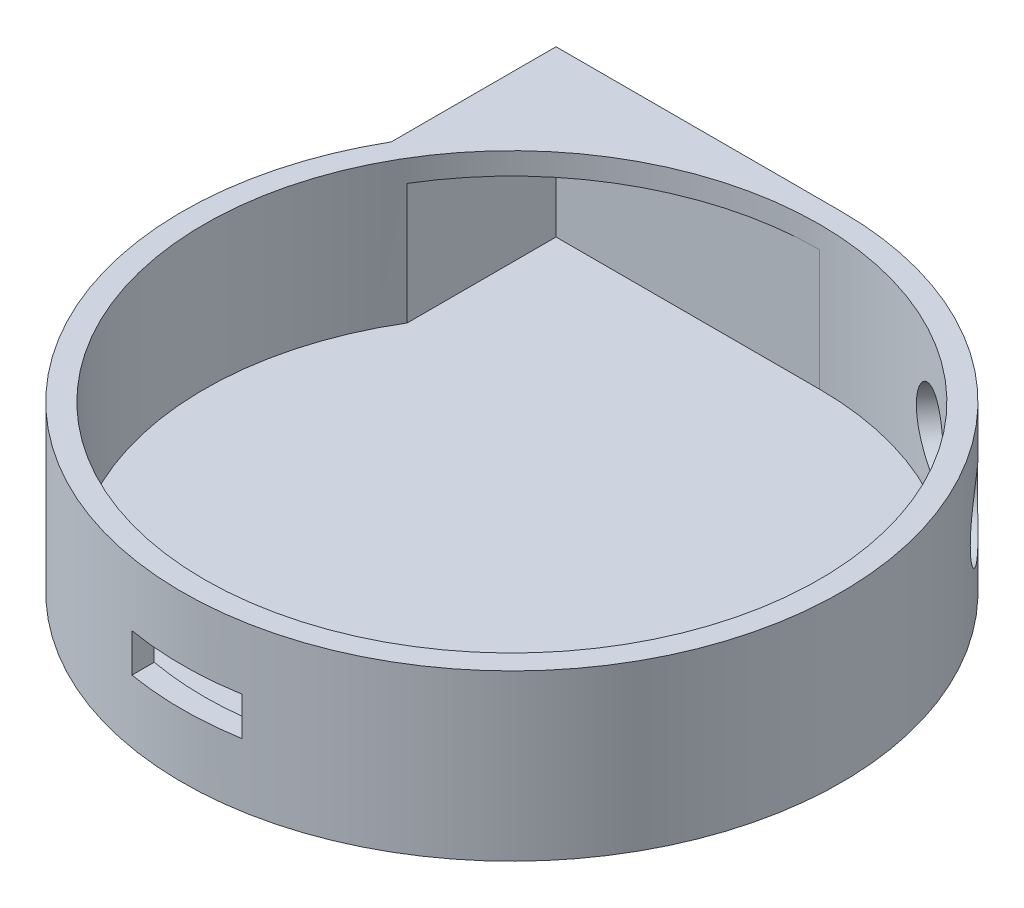
ISO-10303-21;
HEADER;
FILE_DESCRIPTION(('STEP AP214'),'2;1');
FILE_NAME('part.step','',(''),(''),'','','');
FILE_SCHEMA(('AUTOMOTIVE_DESIGN { 1 0 10303 214 1 1 1 1 }'));
ENDSEC;
DATA;
#1=APPLICATION_CONTEXT('core data for automotive mechanical design processes');
#2=APPLICATION_PROTOCOL_DEFINITION('international standard','automotive_design',2000,#1);
#3=PRODUCT_CONTEXT('',#1,'mechanical');
#4=PRODUCT('Part','Part','',(#3));
#5=PRODUCT_RELATED_PRODUCT_CATEGORY('part','',(#4));
#6=PRODUCT_DEFINITION_FORMATION('','',#4);
#7=PRODUCT_DEFINITION_CONTEXT('part definition',#1,'design');
#8=PRODUCT_DEFINITION('design','',#6,#7);
#9=PRODUCT_DEFINITION_SHAPE('','',#8);
#10=(LENGTH_UNIT() NAMED_UNIT(*) SI_UNIT(.MILLI.,.METRE.));
#11=(NAMED_UNIT(*) PLANE_ANGLE_UNIT() SI_UNIT($,.RADIAN.));
#12=(NAMED_UNIT(*) SI_UNIT($,.STERADIAN.) SOLID_ANGLE_UNIT());
#13=UNCERTAINTY_MEASURE_WITH_UNIT(LENGTH_MEASURE(1.E-05),#10,'distance_accuracy_value','');
#14=(GEOMETRIC_REPRESENTATION_CONTEXT(3) GLOBAL_UNCERTAINTY_ASSIGNED_CONTEXT((#13)) GLOBAL_UNIT_ASSIGNED_CONTEXT((#10,
#11,#12)) REPRESENTATION_CONTEXT('',''));
#15=CARTESIAN_POINT('',(0.,0.,0.));
#16=DIRECTION('',(0.,0.,1.));
#17=DIRECTION('',(1.,0.,0.));
#18=AXIS2_PLACEMENT_3D('',#15,#16,#17);
#19=CARTESIAN_POINT('',(0.,15.,-28.));
#20=DIRECTION('',(0.,0.,1.));
#21=DIRECTION('',(1.,0.,0.));
#22=AXIS2_PLACEMENT_3D('',#19,#20,#21);
#23=PLANE('',#22);
#24=DIRECTION('',(0.,-1.,0.));
#25=VECTOR('',#24,1.);
#26=CARTESIAN_POINT('',(0.,15.,-28.));
#27=LINE('',#26,#25);
#28=CARTESIAN_POINT('',(0.,13.,-28.));
#29=VERTEX_POINT('',#28);
#30=CARTESIAN_POINT('',(0.,2.,-28.));
#31=VERTEX_POINT('',#30);
#32=EDGE_CURVE('E70',#29,#31,#27,.T.);
#33=ORIENTED_EDGE('',*,*,#32,.F.);
#34=DIRECTION('',(-1.,0.,0.));
#35=VECTOR('',#34,1.);
#36=CARTESIAN_POINT('',(-23.9807621135331,13.,-28.));
#37=LINE('',#36,#35);
#38=CARTESIAN_POINT('',(-23.9807621135331,13.,-28.));
#39=VERTEX_POINT('',#38);
#40=EDGE_CURVE('E212',#29,#39,#37,.T.);
#41=ORIENTED_EDGE('',*,*,#40,.T.);
#42=DIRECTION('',(0.,-1.,0.));
#43=VECTOR('',#42,1.);
#44=CARTESIAN_POINT('',(-23.9807621135331,15.,-28.));
#45=LINE('',#44,#43);
#46=CARTESIAN_POINT('',(-23.9807621135331,2.,-28.));
#47=VERTEX_POINT('',#46);
#48=EDGE_CURVE('E244',#39,#47,#45,.T.);
#49=ORIENTED_EDGE('',*,*,#48,.T.);
#50=DIRECTION('',(-1.,0.,0.));
#51=VECTOR('',#50,1.);
#52=CARTESIAN_POINT('',(0.,2.,-28.));
#53=LINE('',#52,#51);
#54=EDGE_CURVE('E235',#31,#47,#53,.T.);
#55=ORIENTED_EDGE('',*,*,#54,.F.);
#56=EDGE_LOOP('',(#33,#41,#49,#55));
#57=FACE_BOUND('',#56,.T.);
#58=ADVANCED_FACE('F38',(#57),#23,.T.);
#59=CARTESIAN_POINT('',(-23.9807621135331,15.,-28.));
#60=DIRECTION('',(1.,0.,0.));
#61=DIRECTION('',(0.,0.,-1.));
#62=AXIS2_PLACEMENT_3D('',#59,#60,#61);
#63=PLANE('',#62);
#64=ORIENTED_EDGE('',*,*,#48,.F.);
#65=DIRECTION('',(0.,0.,1.));
#66=VECTOR('',#65,1.);
#67=CARTESIAN_POINT('',(-23.9807621135331,13.,-14.4541706249142));
#68=LINE('',#67,#66);
#69=CARTESIAN_POINT('',(-23.9807621135331,13.,-14.4541706249142));
#70=VERTEX_POINT('',#69);
#71=EDGE_CURVE('E218',#39,#70,#68,.T.);
#72=ORIENTED_EDGE('',*,*,#71,.T.);
#73=DIRECTION('',(0.,-1.,0.));
#74=VECTOR('',#73,1.);
#75=CARTESIAN_POINT('',(-23.9807621135331,15.,-14.4541706249142));
#76=LINE('',#75,#74);
#77=CARTESIAN_POINT('',(-23.9807621135331,2.,-14.4541706249142));
#78=VERTEX_POINT('',#77);
#79=EDGE_CURVE('E230',#70,#78,#76,.T.);
#80=ORIENTED_EDGE('',*,*,#79,.T.);
#81=DIRECTION('',(0.,0.,1.));
#82=VECTOR('',#81,1.);
#83=CARTESIAN_POINT('',(-23.9807621135331,2.,-28.));
#84=LINE('',#83,#82);
#85=EDGE_CURVE('E231',#47,#78,#84,.T.);
#86=ORIENTED_EDGE('',*,*,#85,.F.);
#87=EDGE_LOOP('',(#64,#72,#80,#86));
#88=FACE_BOUND('',#87,.T.);
#89=ADVANCED_FACE('F311',(#88),#63,.T.);
#90=CARTESIAN_POINT('',(0.,2.,0.));
#91=DIRECTION('',(0.,-1.,0.));
#92=DIRECTION('',(0.,0.,-1.));
#93=AXIS2_PLACEMENT_3D('',#90,#91,#92);
#94=CYLINDRICAL_SURFACE('',#93,30.);
#95=CARTESIAN_POINT('',(20.0389566293642,7.5,-22.3257747280237));
#96=CARTESIAN_POINT('',(20.0389637945299,7.3035632484837,-22.3257705114627));
#97=CARTESIAN_POINT('',(20.0513196641735,7.10700178050645,-22.3146971251879));
#98=CARTESIAN_POINT('',(20.100329738802,6.71930794639895,-22.2705588473128));
#99=CARTESIAN_POINT('',(20.1370096863303,6.52818155601912,-22.2374706569862));
#100=CARTESIAN_POINT('',(20.2333131524531,6.1569955120017,-22.1498815270531));
#101=CARTESIAN_POINT('',(20.2929279064318,5.97693166122355,-22.0953887671104));
#102=CARTESIAN_POINT('',(20.432907357123,5.63297485888916,-21.9660041082097));
#103=CARTESIAN_POINT('',(20.5132673964238,5.46907828910427,-21.8911167877171));
#104=CARTESIAN_POINT('',(20.6917689369591,5.16218786421855,-21.7224703250559));
#105=CARTESIAN_POINT('',(20.7898968126396,5.01917814247885,-21.6287256378958));
#106=CARTESIAN_POINT('',(21.000491043588,4.75796407194832,-21.4243054153114));
#107=CARTESIAN_POINT('',(21.112957544234,4.63975997469147,-21.313629708223));
#108=CARTESIAN_POINT('',(21.3481496827962,4.43161661861114,-21.0780484048878));
#109=CARTESIAN_POINT('',(21.4708595612192,4.34163491843072,-20.9531645642869));
#110=CARTESIAN_POINT('',(21.7225939858402,4.19210005858461,-20.6920701053367));
#111=CARTESIAN_POINT('',(21.8516185229927,4.13254685533245,-20.5558595032126));
#112=CARTESIAN_POINT('',(22.1122930857986,4.04518698834769,-20.2751884415133));
#113=CARTESIAN_POINT('',(22.2439498033879,4.01747569638072,-20.1307045517789));
#114=CARTESIAN_POINT('',(22.5056182436383,3.99460402244713,-19.83773499251));
#115=CARTESIAN_POINT('',(22.6356298596469,3.99944574018034,-19.6892490654555));
#116=CARTESIAN_POINT('',(22.892068646829,4.04152435748208,-19.3905241519328));
#117=CARTESIAN_POINT('',(23.0184310394554,4.07916382698086,-19.2402863555886));
#118=CARTESIAN_POINT('',(23.2626756147384,4.18612387011675,-18.9442545853886));
#119=CARTESIAN_POINT('',(23.3805568282268,4.25544805782133,-18.7984611204925));
#120=CARTESIAN_POINT('',(23.6069624693989,4.42519803050809,-18.5133739942603));
#121=CARTESIAN_POINT('',(23.7153031550304,4.52611214865009,-18.3742249359536));
#122=CARTESIAN_POINT('',(23.918042140513,4.75593964149584,-18.1095305720568));
#123=CARTESIAN_POINT('',(24.0124395995807,4.88485470351322,-17.9839860869506));
#124=CARTESIAN_POINT('',(24.1855216903356,5.16771967020593,-17.750542424074));
#125=CARTESIAN_POINT('',(24.2641611582852,5.32173930187923,-17.6426941206796));
#126=CARTESIAN_POINT('',(24.4036693396332,5.65041806627058,-17.4492176916881));
#127=CARTESIAN_POINT('',(24.4645403709028,5.82507450276286,-17.3635866680359));
#128=CARTESIAN_POINT('',(24.5659879977796,6.18605147202019,-17.219751660154));
#129=CARTESIAN_POINT('',(24.6069828374306,6.37202951093927,-17.1609840771776));
#130=CARTESIAN_POINT('',(24.6696781556365,6.75360408361224,-17.0707363219806));
#131=CARTESIAN_POINT('',(24.6913830202954,6.94919842015797,-17.0392499466715));
#132=CARTESIAN_POINT('',(24.7145938242672,7.3377277030516,-17.0055654091759));
#133=CARTESIAN_POINT('',(24.7167238212904,7.5305475043218,-17.0024623852858));
#134=CARTESIAN_POINT('',(24.7023653208344,7.91400472234951,-17.0233164962066));
#135=CARTESIAN_POINT('',(24.6858783554164,8.10464231738507,-17.0472714043167));
#136=CARTESIAN_POINT('',(24.634970657889,8.47611367113592,-17.1207524424735));
#137=CARTESIAN_POINT('',(24.600756797862,8.65703450307181,-17.1699835415977));
#138=CARTESIAN_POINT('',(24.5152680003269,9.00654037428347,-17.2918229703511));
#139=CARTESIAN_POINT('',(24.4639915147833,9.17512429257832,-17.3644334210922));
#140=CARTESIAN_POINT('',(24.3442442370064,9.49888423010685,-17.531929217319));
#141=CARTESIAN_POINT('',(24.2754507614667,9.65372557845812,-17.6272301310351));
#142=CARTESIAN_POINT('',(24.1225914066096,9.94229663946289,-17.8358424135173));
#143=CARTESIAN_POINT('',(24.0385229264709,10.0760227496406,-17.949156848971));
#144=CARTESIAN_POINT('',(23.8538477406065,10.3230226059943,-18.1939040629209));
#145=CARTESIAN_POINT('',(23.7527991753754,10.4355082581581,-18.3257993498028));
#146=CARTESIAN_POINT('',(23.5383063725614,10.6316709203741,-18.6004966471364));
#147=CARTESIAN_POINT('',(23.4248607849265,10.7153447886582,-18.7432998449632));
#148=CARTESIAN_POINT('',(23.1861191314815,10.8527339919558,-19.037866887467));
#149=CARTESIAN_POINT('',(23.0606571551671,10.9059271194473,-19.1897403645477));
#150=CARTESIAN_POINT('',(22.8026838101664,10.978470498804,-19.4955792735338));
#151=CARTESIAN_POINT('',(22.6701726670616,10.997821832975,-19.6495446383792));
#152=CARTESIAN_POINT('',(22.4027320452607,11.0018157842413,-19.9539055002358));
#153=CARTESIAN_POINT('',(22.2678263429517,10.9867032673697,-20.104318558149));
#154=CARTESIAN_POINT('',(21.9987674848002,10.9223922217258,-20.3983809925001));
#155=CARTESIAN_POINT('',(21.8646142589601,10.8731969182791,-20.5420310075654));
#156=CARTESIAN_POINT('',(21.6036418227631,10.7430114836614,-20.8162900651782));
#157=CARTESIAN_POINT('',(21.4767375599016,10.662565910736,-20.9470767960193));
#158=CARTESIAN_POINT('',(21.2321546739004,10.4720270919889,-21.1949512066881));
#159=CARTESIAN_POINT('',(21.1144752168041,10.3619365301836,-21.3120401253209));
#160=CARTESIAN_POINT('',(20.8935954472806,10.1164857640728,-21.5286181392546));
#161=CARTESIAN_POINT('',(20.7902590748825,9.98139616836151,-21.6282753467547));
#162=CARTESIAN_POINT('',(20.6002718097719,9.68899701453022,-21.809311523532));
#163=CARTESIAN_POINT('',(20.5136243937378,9.53168283834545,-21.890686684841));
#164=CARTESIAN_POINT('',(20.3602201131574,9.19948264516118,-22.0334392048592));
#165=CARTESIAN_POINT('',(20.293447575289,9.02461062060201,-22.0948323249901));
#166=CARTESIAN_POINT('',(20.1821791861417,8.66225888927409,-22.1965171482199));
#167=CARTESIAN_POINT('',(20.1376600692387,8.47479258331226,-22.2368308915371));
#168=CARTESIAN_POINT('',(20.0831320462646,8.15531800487354,-22.2860636185646));
#169=CARTESIAN_POINT('',(20.0665945536392,8.02527241275366,-22.30094183369));
#170=CARTESIAN_POINT('',(20.0445044316665,7.76350325830348,-22.3207988119031));
#171=CARTESIAN_POINT('',(20.0389518226092,7.63177969287427,-22.3257775567057));
#172=CARTESIAN_POINT('',(20.0389566293642,7.5,-22.3257747280237));
#173=B_SPLINE_CURVE_WITH_KNOTS('',3,(#95,#96,#97,#98,#99,#100,#101,#102,#103,#104,#105,#106,
#107,#108,#109,#110,#111,#112,#113,#114,#115,#116,#117,#118,#119,#120,#121,#122,#123,#124,#125,
#126,#127,#128,#129,#130,#131,#132,#133,#134,#135,#136,#137,#138,#139,#140,#141,#142,#143,#144,
#145,#146,#147,#148,#149,#150,#151,#152,#153,#154,#155,#156,#157,#158,#159,#160,#161,#162,#163,
#164,#165,#166,#167,#168,#169,#170,#171,#172),.UNSPECIFIED.,.T.,.F.,(4,2,2,2,2,2,2,2,2,2,2,2,2,
2,2,2,2,2,2,2,2,2,2,2,2,2,2,2,2,2,2,2,2,2,2,2,2,2,4),(0.,0.58883183811517,1.17828784261022,
1.76751880784998,2.35661760290563,2.94526653668943,3.53392143920217,4.12168681960561,
4.70945135807832,5.29897179655288,5.88853026001688,6.48542873356221,7.08239530838978,
7.68908821330915,8.29581768718676,8.90426198034726,9.51262686717679,10.1075653064958,
10.7023684356378,11.2781404614046,11.8538651081363,12.4230175484,12.9922216400652,
13.5727837979454,14.1534448988975,14.7526207257785,15.3518618688449,15.961084067399,
16.5702867818583,17.1751746015103,17.7800051871784,18.3747375522199,18.9694160891056,
19.5579985581133,20.1467035095596,20.7349429709456,21.3225661435701,21.7175835466598,
22.1126016793791),.UNSPECIFIED.);
#174=CARTESIAN_POINT('',(20.0389566293642,7.5,-22.3257747280237));
#175=VERTEX_POINT('',#174);
#176=EDGE_CURVE('E141',#175,#175,#173,.T.);
#177=ORIENTED_EDGE('',*,*,#176,.T.);
#178=EDGE_LOOP('',(#177));
#179=FACE_BOUND('',#178,.T.);
#180=CARTESIAN_POINT('',(12.4569898038769,7.5,-27.2914529665628));
#181=CARTESIAN_POINT('',(12.4569993073483,7.30801914953252,-27.2914504049319));
#182=CARTESIAN_POINT('',(12.4719666942975,7.1159133075882,-27.2846322120003));
#183=CARTESIAN_POINT('',(12.5312544884025,6.73713856654294,-27.2574518185044));
#184=CARTESIAN_POINT('',(12.575606745876,6.55047579665205,-27.2370749215309));
#185=CARTESIAN_POINT('',(12.6917843439682,6.188224147237,-27.1831322408752));
#186=CARTESIAN_POINT('',(12.7635709156434,6.0126200461419,-27.1495850670214));
#187=CARTESIAN_POINT('',(12.9318755181621,5.67688612062378,-27.069821353359));
#188=CARTESIAN_POINT('',(13.0283910020979,5.51675470495831,-27.0236061182391));
#189=CARTESIAN_POINT('',(13.2448889102017,5.21297444942567,-26.9181658813485));
#190=CARTESIAN_POINT('',(13.3652917575692,5.06970735378007,-26.858705036707));
#191=CARTESIAN_POINT('',(13.6243399871578,4.80687822699691,-26.728231601713));
#192=CARTESIAN_POINT('',(13.7629886195353,4.6873204287762,-26.6572169527256));
#193=CARTESIAN_POINT('',(14.0586114057681,4.47169745922206,-26.5025290298126));
#194=CARTESIAN_POINT('',(14.2160067487907,4.3764331230389,-26.4185430867947));
#195=CARTESIAN_POINT('',(14.540826447763,4.21672401627227,-26.2411620444131));
#196=CARTESIAN_POINT('',(14.708251502627,4.1522813962985,-26.1477662890225));
#197=CARTESIAN_POINT('',(15.0496688167354,4.0557077191913,-25.9527728696322));
#198=CARTESIAN_POINT('',(15.2237056310824,4.02386350068113,-25.8511107509395));
#199=CARTESIAN_POINT('',(15.5717832734015,3.99466888172788,-25.6429458297613));
#200=CARTESIAN_POINT('',(15.7458241002155,3.99731603719101,-25.5364433708003));
#201=CARTESIAN_POINT('',(16.0866982693606,4.03709727707668,-25.3230741789882));
#202=CARTESIAN_POINT('',(16.2535939038639,4.07380711697615,-25.2162280096596));
#203=CARTESIAN_POINT('',(16.5776917050701,4.18033301005883,-25.0043522863531));
#204=CARTESIAN_POINT('',(16.734894732873,4.25014611751483,-24.899322571598));
#205=CARTESIAN_POINT('',(17.0328948453807,4.41967016572208,-24.6964070199655));
#206=CARTESIAN_POINT('',(17.1739123261968,4.5188900951486,-24.5984343869306));
#207=CARTESIAN_POINT('',(17.4387446531315,4.74486463635083,-24.4114011244537));
#208=CARTESIAN_POINT('',(17.5625601734903,4.87161816843239,-24.3223401457529));
#209=CARTESIAN_POINT('',(17.789169033906,5.14809437904165,-24.1570909800734));
#210=CARTESIAN_POINT('',(17.8921016862765,5.29765233844681,-24.0808181181061));
#211=CARTESIAN_POINT('',(18.0756543468481,5.61613457048388,-23.9433479442164));
#212=CARTESIAN_POINT('',(18.1562743551538,5.78505884302487,-23.8821506322232));
#213=CARTESIAN_POINT('',(18.2934664291001,6.13755229570724,-23.7772282641851));
#214=CARTESIAN_POINT('',(18.3500289736656,6.32112723998365,-23.7335101261755));
#215=CARTESIAN_POINT('',(18.4378715653712,6.6976627930153,-23.6653334671287));
#216=CARTESIAN_POINT('',(18.4691514228852,6.89062347215425,-23.6408750905442));
#217=CARTESIAN_POINT('',(18.5058146220259,7.28076528546517,-23.6121870960918));
#218=CARTESIAN_POINT('',(18.5111587953512,7.47795235160864,-23.6079880741375));
#219=CARTESIAN_POINT('',(18.4957356493125,7.8706714445441,-23.6200731142969));
#220=CARTESIAN_POINT('',(18.4749681967319,8.06620346288724,-23.6363572809117));
#221=CARTESIAN_POINT('',(18.4077322652502,8.45014152096113,-23.6887566293203));
#222=CARTESIAN_POINT('',(18.3612535425466,8.63854468845251,-23.7248797152318));
#223=CARTESIAN_POINT('',(18.2435568985565,9.00278617376384,-23.815501568694));
#224=CARTESIAN_POINT('',(18.1723390516315,9.17862452934951,-23.8700002810107));
#225=CARTESIAN_POINT('',(18.0067537020172,9.512622283627,-23.9951566453152));
#226=CARTESIAN_POINT('',(17.9124010817107,9.67079295293894,-24.0658039071207));
#227=CARTESIAN_POINT('',(17.7026515021607,9.96508294291932,-24.2205091586669));
#228=CARTESIAN_POINT('',(17.5872549711256,10.1012027121803,-24.304566875523));
#229=CARTESIAN_POINT('',(17.3383632219777,10.3473393603411,-24.4827387894551));
#230=CARTESIAN_POINT('',(17.204898304963,10.4573991106857,-24.5768360950945));
#231=CARTESIAN_POINT('',(16.9230473971957,10.6486652786735,-24.7717537750302));
#232=CARTESIAN_POINT('',(16.774661643672,10.7298721549603,-24.8725740424285));
#233=CARTESIAN_POINT('',(16.4667230541704,10.8613449891967,-25.0775044694995));
#234=CARTESIAN_POINT('',(16.3071632872179,10.9115915504644,-25.1816166487122));
#235=CARTESIAN_POINT('',(15.9812283454205,10.9799041017849,-25.3897167900923));
#236=CARTESIAN_POINT('',(15.814852873876,10.9979686893737,-25.4937047466487));
#237=CARTESIAN_POINT('',(15.4783059166942,11.0017238573385,-25.6994414350084));
#238=CARTESIAN_POINT('',(15.3081137273636,10.9871209535601,-25.8011615083935));
#239=CARTESIAN_POINT('',(14.9701595009489,10.9256220621607,-25.9987050002941));
#240=CARTESIAN_POINT('',(14.80239771673,10.8787227386309,-26.094527808565));
#241=CARTESIAN_POINT('',(14.4713397550349,10.7530486197065,-26.2795908436584));
#242=CARTESIAN_POINT('',(14.3081631274866,10.6737600584982,-26.3686961808739));
#243=CARTESIAN_POINT('',(13.9941133511336,10.4855289380144,-26.5367019004439));
#244=CARTESIAN_POINT('',(13.8432410041338,10.3765844482225,-26.6156016179482));
#245=CARTESIAN_POINT('',(13.5571569683022,10.1307160502177,-26.7624668559506));
#246=CARTESIAN_POINT('',(13.4221099384321,9.99353300498157,-26.8303198602176));
#247=CARTESIAN_POINT('',(13.1739927404732,9.69542728089768,-26.9530169859769));
#248=CARTESIAN_POINT('',(13.0609262775575,9.53450060771273,-27.0078589145889));
#249=CARTESIAN_POINT('',(12.8623522778517,9.19556183624912,-27.1029868554511));
#250=CARTESIAN_POINT('',(12.7765057371844,9.01779891212803,-27.1434527442335));
#251=CARTESIAN_POINT('',(12.6339371373058,8.64861733177753,-27.2101064099645));
#252=CARTESIAN_POINT('',(12.5771753761788,8.45721769918724,-27.2363136535866));
#253=CARTESIAN_POINT('',(12.5099071267718,8.13711469864084,-27.2672515137561));
#254=CARTESIAN_POINT('',(12.4901015071594,8.01069610477373,-27.2763189797257));
#255=CARTESIAN_POINT('',(12.4636398650619,7.75620353366523,-27.2884204734578));
#256=CARTESIAN_POINT('',(12.4569834611815,7.6281296045456,-27.2914546762164));
#257=CARTESIAN_POINT('',(12.4569898038769,7.5,-27.2914529665628));
#258=B_SPLINE_CURVE_WITH_KNOTS('',3,(#180,#181,#182,#183,#184,#185,#186,#187,#188,#189,#190,
#191,#192,#193,#194,#195,#196,#197,#198,#199,#200,#201,#202,#203,#204,#205,#206,#207,#208,#209,
#210,#211,#212,#213,#214,#215,#216,#217,#218,#219,#220,#221,#222,#223,#224,#225,#226,#227,#228,
#229,#230,#231,#232,#233,#234,#235,#236,#237,#238,#239,#240,#241,#242,#243,#244,#245,#246,#247,
#248,#249,#250,#251,#252,#253,#254,#255,#256,#257),.UNSPECIFIED.,.T.,.F.,(4,2,2,2,2,2,2,2,2,2,2,
2,2,2,2,2,2,2,2,2,2,2,2,2,2,2,2,2,2,2,2,2,2,2,2,2,2,2,4),(0.,0.575465504433019,1.15155577972194,
1.72683494253998,2.30205487936752,2.88847753119597,3.47500478536351,4.07890670665457,
4.68285075953564,5.292064486236,5.90123504366796,6.50291888914972,7.1045492032408,
7.69665132053991,8.28873022352074,8.8767190568999,9.46470788751866,10.0529292068292,
10.6411549378973,11.2302687368582,11.819385541376,12.4087372291589,12.998087145469,
13.5870589286151,14.1760187285062,14.7640027897828,15.3519775040817,15.940320211837,
16.5286885584578,17.12236400317,17.7161007780306,18.3196457384935,18.9232299974151,
19.532622071266,20.1421167789117,20.7436918660817,21.3444435762285,21.7285251452974,
22.1125955738484),.UNSPECIFIED.);
#259=CARTESIAN_POINT('',(12.4569898038769,7.5,-27.2914529665628));
#260=VERTEX_POINT('',#259);
#261=EDGE_CURVE('E160',#260,#260,#258,.T.);
#262=ORIENTED_EDGE('',*,*,#261,.T.);
#263=EDGE_LOOP('',(#262));
#264=FACE_BOUND('',#263,.T.);
#265=CARTESIAN_POINT('',(0.,9.25,0.));
#266=DIRECTION('',(0.,1.,0.));
#267=DIRECTION('',(0.,0.,1.));
#268=AXIS2_PLACEMENT_3D('',#265,#266,#267);
#269=CIRCLE('',#268,30.);
#270=CARTESIAN_POINT('',(-5.,9.25,29.5803989154981));
#271=VERTEX_POINT('',#270);
#272=CARTESIAN_POINT('',(5.,9.25,29.5803989154981));
#273=VERTEX_POINT('',#272);
#274=EDGE_CURVE('E190',#271,#273,#269,.T.);
#275=ORIENTED_EDGE('',*,*,#274,.T.);
#276=DIRECTION('',(0.,-1.,0.));
#277=VECTOR('',#276,1.);
#278=CARTESIAN_POINT('',(5.,2.,29.5803989154981));
#279=LINE('',#278,#277);
#280=CARTESIAN_POINT('',(5.,5.75,29.5803989154981));
#281=VERTEX_POINT('',#280);
#282=EDGE_CURVE('E139',#273,#281,#279,.T.);
#283=ORIENTED_EDGE('',*,*,#282,.T.);
#284=CARTESIAN_POINT('',(0.,5.75,0.));
#285=DIRECTION('',(0.,-1.,0.));
#286=DIRECTION('',(0.,0.,-1.));
#287=AXIS2_PLACEMENT_3D('',#284,#285,#286);
#288=CIRCLE('',#287,30.);
#289=CARTESIAN_POINT('',(-5.,5.75,29.5803989154981));
#290=VERTEX_POINT('',#289);
#291=EDGE_CURVE('E202',#281,#290,#288,.T.);
#292=ORIENTED_EDGE('',*,*,#291,.T.);
#293=DIRECTION('',(0.,-1.,0.));
#294=VECTOR('',#293,1.);
#295=CARTESIAN_POINT('',(-5.,2.,29.5803989154981));
#296=LINE('',#295,#294);
#297=EDGE_CURVE('E198',#290,#271,#296,.F.);
#298=ORIENTED_EDGE('',*,*,#297,.T.);
#299=EDGE_LOOP('',(#275,#283,#292,#298));
#300=FACE_BOUND('',#299,.T.);
#301=CARTESIAN_POINT('',(0.,0.,0.));
#302=DIRECTION('',(0.,1.,0.));
#303=DIRECTION('',(0.,0.,1.));
#304=AXIS2_PLACEMENT_3D('',#301,#302,#303);
#305=CIRCLE('',#304,30.);
#306=CARTESIAN_POINT('',(-25.9807621135332,0.,-15.));
#307=VERTEX_POINT('',#306);
#308=CARTESIAN_POINT('',(0.,0.,-30.));
#309=VERTEX_POINT('',#308);
#310=EDGE_CURVE('E261',#307,#309,#305,.T.);
#311=ORIENTED_EDGE('',*,*,#310,.T.);
#312=DIRECTION('',(0.,-1.,0.));
#313=VECTOR('',#312,1.);
#314=CARTESIAN_POINT('',(0.,2.,-30.));
#315=LINE('',#314,#313);
#316=CARTESIAN_POINT('',(0.,15.,-30.));
#317=VERTEX_POINT('',#316);
#318=EDGE_CURVE('E131',#317,#309,#315,.T.);
#319=ORIENTED_EDGE('',*,*,#318,.F.);
#320=CARTESIAN_POINT('',(0.,15.,0.));
#321=DIRECTION('',(0.,1.,0.));
#322=DIRECTION('',(0.,0.,1.));
#323=AXIS2_PLACEMENT_3D('',#320,#321,#322);
#324=CIRCLE('',#323,30.);
#325=CARTESIAN_POINT('',(-25.9807621135332,15.,-15.));
#326=VERTEX_POINT('',#325);
#327=EDGE_CURVE('E249',#326,#317,#324,.T.);
#328=ORIENTED_EDGE('',*,*,#327,.F.);
#329=DIRECTION('',(0.,-1.,0.));
#330=VECTOR('',#329,1.);
#331=CARTESIAN_POINT('',(-25.9807621135332,2.,-15.));
#332=LINE('',#331,#330);
#333=EDGE_CURVE('E271',#326,#307,#332,.T.);
#334=ORIENTED_EDGE('',*,*,#333,.T.);
#335=EDGE_LOOP('',(#311,#319,#328,#334));
#336=FACE_BOUND('',#335,.T.);
#337=ADVANCED_FACE('F40',(#179,#264,#300,#336),#94,.T.);
#338=CARTESIAN_POINT('',(-25.9807621135332,2.,-30.));
#339=DIRECTION('',(0.,0.,1.));
#340=DIRECTION('',(1.,0.,0.));
#341=AXIS2_PLACEMENT_3D('',#338,#339,#340);
#342=PLANE('',#341);
#343=DIRECTION('',(-1.,0.,0.));
#344=VECTOR('',#343,1.);
#345=CARTESIAN_POINT('',(-25.9807621135332,0.,-30.));
#346=LINE('',#345,#344);
#347=CARTESIAN_POINT('',(-25.9807621135332,0.,-30.));
#348=VERTEX_POINT('',#347);
#349=EDGE_CURVE('E265',#309,#348,#346,.T.);
#350=ORIENTED_EDGE('',*,*,#349,.T.);
#351=DIRECTION('',(0.,-1.,0.));
#352=VECTOR('',#351,1.);
#353=CARTESIAN_POINT('',(-25.9807621135332,2.,-30.));
#354=LINE('',#353,#352);
#355=CARTESIAN_POINT('',(-25.9807621135332,15.,-30.));
#356=VERTEX_POINT('',#355);
#357=EDGE_CURVE('E275',#356,#348,#354,.T.);
#358=ORIENTED_EDGE('',*,*,#357,.F.);
#359=DIRECTION('',(-1.,0.,0.));
#360=VECTOR('',#359,1.);
#361=CARTESIAN_POINT('',(0.,15.,-30.));
#362=LINE('',#361,#360);
#363=EDGE_CURVE('E253',#317,#356,#362,.T.);
#364=ORIENTED_EDGE('',*,*,#363,.F.);
#365=ORIENTED_EDGE('',*,*,#318,.T.);
#366=EDGE_LOOP('',(#350,#358,#364,#365));
#367=FACE_BOUND('',#366,.T.);
#368=ADVANCED_FACE('F283',(#367),#342,.F.);
#369=CARTESIAN_POINT('',(-25.9807621135332,2.,-15.));
#370=DIRECTION('',(1.,0.,0.));
#371=DIRECTION('',(0.,0.,-1.));
#372=AXIS2_PLACEMENT_3D('',#369,#370,#371);
#373=PLANE('',#372);
#374=DIRECTION('',(0.,0.,1.));
#375=VECTOR('',#374,1.);
#376=CARTESIAN_POINT('',(-25.9807621135332,0.,-15.));
#377=LINE('',#376,#375);
#378=EDGE_CURVE('E268',#348,#307,#377,.T.);
#379=ORIENTED_EDGE('',*,*,#378,.T.);
#380=ORIENTED_EDGE('',*,*,#333,.F.);
#381=DIRECTION('',(0.,0.,1.));
#382=VECTOR('',#381,1.);
#383=CARTESIAN_POINT('',(-25.9807621135332,15.,-30.));
#384=LINE('',#383,#382);
#385=EDGE_CURVE('E257',#356,#326,#384,.T.);
#386=ORIENTED_EDGE('',*,*,#385,.F.);
#387=ORIENTED_EDGE('',*,*,#357,.T.);
#388=EDGE_LOOP('',(#379,#380,#386,#387));
#389=FACE_BOUND('',#388,.T.);
#390=ADVANCED_FACE('F291',(#389),#373,.F.);
#391=CARTESIAN_POINT('',(0.,0.,0.));
#392=DIRECTION('',(0.,1.,0.));
#393=DIRECTION('',(0.,0.,1.));
#394=AXIS2_PLACEMENT_3D('',#391,#392,#393);
#395=PLANE('',#394);
#396=CARTESIAN_POINT('',(0.,0.,0.));
#397=DIRECTION('',(0.,-1.,0.));
#398=DIRECTION('',(0.,0.,-1.));
#399=AXIS2_PLACEMENT_3D('',#396,#397,#398);
#400=CIRCLE('',#399,12.5);
#401=CARTESIAN_POINT('',(0.,0.,-12.5));
#402=VERTEX_POINT('',#401);
#403=EDGE_CURVE('E207',#402,#402,#400,.T.);
#404=ORIENTED_EDGE('',*,*,#403,.F.);
#405=EDGE_LOOP('',(#404));
#406=FACE_BOUND('',#405,.T.);
#407=ORIENTED_EDGE('',*,*,#310,.F.);
#408=ORIENTED_EDGE('',*,*,#378,.F.);
#409=ORIENTED_EDGE('',*,*,#349,.F.);
#410=EDGE_LOOP('',(#407,#408,#409));
#411=FACE_BOUND('',#410,.T.);
#412=ADVANCED_FACE('F289',(#406,#411),#395,.F.);
#413=CARTESIAN_POINT('',(0.,15.,0.));
#414=DIRECTION('',(0.,1.,0.));
#415=DIRECTION('',(0.,0.,1.));
#416=AXIS2_PLACEMENT_3D('',#413,#414,#415);
#417=PLANE('',#416);
#418=ORIENTED_EDGE('',*,*,#327,.T.);
#419=ORIENTED_EDGE('',*,*,#363,.T.);
#420=ORIENTED_EDGE('',*,*,#385,.T.);
#421=EDGE_LOOP('',(#418,#419,#420));
#422=FACE_BOUND('',#421,.T.);
#423=CARTESIAN_POINT('',(0.,15.,0.));
#424=DIRECTION('',(0.,1.,0.));
#425=DIRECTION('',(0.,0.,1.));
#426=AXIS2_PLACEMENT_3D('',#423,#424,#425);
#427=CIRCLE('',#426,28.);
#428=CARTESIAN_POINT('',(0.,15.,28.));
#429=VERTEX_POINT('',#428);
#430=EDGE_CURVE('E226',#429,#429,#427,.T.);
#431=ORIENTED_EDGE('',*,*,#430,.F.);
#432=EDGE_LOOP('',(#431));
#433=FACE_BOUND('',#432,.T.);
#434=ADVANCED_FACE('F294',(#422,#433),#417,.T.);
#435=CARTESIAN_POINT('',(0.,15.,0.));
#436=DIRECTION('',(0.,-1.,0.));
#437=DIRECTION('',(0.,0.,-1.));
#438=AXIS2_PLACEMENT_3D('',#435,#436,#437);
#439=CYLINDRICAL_SURFACE('',#438,28.);
#440=CARTESIAN_POINT('',(18.7526155016448,7.5,-20.7927730677625));
#441=CARTESIAN_POINT('',(18.7526226533597,7.30358697496603,-20.7927689718292));
#442=CARTESIAN_POINT('',(18.7649505762811,7.10705180854656,-20.7816687800828));
#443=CARTESIAN_POINT('',(18.8138413983838,6.71941213928889,-20.737415911659));
#444=CARTESIAN_POINT('',(18.8504294636825,6.52831349090161,-20.704240335083));
#445=CARTESIAN_POINT('',(18.9464661093933,6.15717854451682,-20.6163923446678));
#446=CARTESIAN_POINT('',(19.0059062781426,5.97713820429855,-20.5617278405516));
#447=CARTESIAN_POINT('',(19.1454226817973,5.63322671438894,-20.4318826203248));
#448=CARTESIAN_POINT('',(19.2254943560427,5.46935200229091,-20.3567064381697));
#449=CARTESIAN_POINT('',(19.4032545373015,5.16252569127791,-20.1873407084693));
#450=CARTESIAN_POINT('',(19.500927271018,5.01955556471146,-20.0931681756711));
#451=CARTESIAN_POINT('',(19.7104110779174,4.75841432902596,-19.8877140673307));
#452=CARTESIAN_POINT('',(19.8222222346016,4.64024336638127,-19.7764323907413));
#453=CARTESIAN_POINT('',(20.0558402711689,4.43217319463614,-19.5394693668838));
#454=CARTESIAN_POINT('',(20.1776295025657,4.34222537206246,-19.4138132943544));
#455=CARTESIAN_POINT('',(20.4272569688468,4.19270738235957,-19.1509788696655));
#456=CARTESIAN_POINT('',(20.5550951966885,4.13313717986334,-19.013800530921));
#457=CARTESIAN_POINT('',(20.8131833577328,4.04563919089699,-18.7309412185983));
#458=CARTESIAN_POINT('',(20.9434400377702,4.01782019423019,-18.585232799774));
#459=CARTESIAN_POINT('',(21.2020719725595,3.99463371829088,-18.2896342154219));
#460=CARTESIAN_POINT('',(21.3304470886573,3.99926861864611,-18.1397437440547));
#461=CARTESIAN_POINT('',(21.5836467325315,4.0408328655496,-17.8377569941094));
#462=CARTESIAN_POINT('',(21.708394501909,4.07822188757189,-17.6856597469691));
#463=CARTESIAN_POINT('',(21.9492965898657,4.18463671466536,-17.3857817481617));
#464=CARTESIAN_POINT('',(22.0654497900355,4.2536666287797,-17.2380015597815));
#465=CARTESIAN_POINT('',(22.2886401481708,4.42299427473092,-16.9484682501812));
#466=CARTESIAN_POINT('',(22.3954651248219,4.52385490450389,-16.8068804515174));
#467=CARTESIAN_POINT('',(22.5952152970456,4.75371061325429,-16.5373645570269));
#468=CARTESIAN_POINT('',(22.688139476693,4.88270774686713,-16.4094374597738));
#469=CARTESIAN_POINT('',(22.8584692849286,5.16601043192445,-16.1713303467938));
#470=CARTESIAN_POINT('',(22.9358197198173,5.32040259078286,-16.0612137137078));
#471=CARTESIAN_POINT('',(23.0729478745143,5.65007146523423,-15.8635933251365));
#472=CARTESIAN_POINT('',(23.1327282586624,5.82534500868259,-15.7760861413755));
#473=CARTESIAN_POINT('',(23.2321022219951,6.18718240199326,-15.6293671672072));
#474=CARTESIAN_POINT('',(23.272168271129,6.37334840614755,-15.5694955038476));
#475=CARTESIAN_POINT('',(23.3333950473054,6.75539987197624,-15.4775891885272));
#476=CARTESIAN_POINT('',(23.3545608215131,6.95128272408778,-15.4455471049654));
#477=CARTESIAN_POINT('',(23.377051958838,7.339418440546,-15.4114839875784));
#478=CARTESIAN_POINT('',(23.3790820615915,7.53153767644339,-15.4083966149285));
#479=CARTESIAN_POINT('',(23.3650934231878,7.91358055394366,-15.4296003756418));
#480=CARTESIAN_POINT('',(23.3490763555468,8.10350439747575,-15.4538889704286));
#481=CARTESIAN_POINT('',(23.2996994722218,8.47322108165719,-15.5282303082639));
#482=CARTESIAN_POINT('',(23.2665711951736,8.65311450837145,-15.5779389947752));
#483=CARTESIAN_POINT('',(23.1838190913666,9.00065932911657,-15.7008276412317));
#484=CARTESIAN_POINT('',(23.1341935687119,9.16830946239052,-15.7740100142149));
#485=CARTESIAN_POINT('',(23.0181084646905,9.4908635720659,-15.9429416157347));
#486=CARTESIAN_POINT('',(22.951287840584,9.64538554345801,-16.0391713153218));
#487=CARTESIAN_POINT('',(22.8027029494197,9.93350377242228,-16.2497172810482));
#488=CARTESIAN_POINT('',(22.7209357949892,10.0670959775033,-16.3640370412534));
#489=CARTESIAN_POINT('',(22.5407163003001,10.3146946194338,-16.6114519880752));
#490=CARTESIAN_POINT('',(22.4417610144358,10.4278003128103,-16.7450829667273));
#491=CARTESIAN_POINT('',(22.2314170851048,10.6252809485839,-17.0233513837887));
#492=CARTESIAN_POINT('',(22.1200268655229,10.7096522434226,-17.1679902166912));
#493=CARTESIAN_POINT('',(21.8849512189462,10.8487101960111,-17.4667021506447));
#494=CARTESIAN_POINT('',(21.7610696015386,10.9027909267865,-17.6209036416168));
#495=CARTESIAN_POINT('',(21.5059442466564,10.9769648885547,-17.9313890082718));
#496=CARTESIAN_POINT('',(21.3747007783514,10.9970593613428,-18.0876728076608));
#497=CARTESIAN_POINT('',(21.1095530093627,11.002318875587,-18.3964084170588));
#498=CARTESIAN_POINT('',(20.975678510136,10.987762903436,-18.5488809129297));
#499=CARTESIAN_POINT('',(20.7083283878574,10.9243532188327,-18.8468884858909));
#500=CARTESIAN_POINT('',(20.5748527224793,10.8755032857651,-18.992424325552));
#501=CARTESIAN_POINT('',(20.315246782467,10.7459149292006,-19.2698256654098));
#502=CARTESIAN_POINT('',(20.1890246188831,10.6658077161145,-19.4019002114691));
#503=CARTESIAN_POINT('',(19.9455205043851,10.4758321540893,-19.6521429565331));
#504=CARTESIAN_POINT('',(19.828237672534,10.3659667425787,-19.7703125264458));
#505=CARTESIAN_POINT('',(19.6081000048457,10.1210384124567,-19.9886521574217));
#506=CARTESIAN_POINT('',(19.5050907520804,9.98628930741711,-20.0890188072094));
#507=CARTESIAN_POINT('',(19.3155438626012,9.69452281423782,-20.2713370898883));
#508=CARTESIAN_POINT('',(19.22900955611,9.53750093508039,-20.353285000244));
#509=CARTESIAN_POINT('',(19.0756828782818,9.20586689327788,-20.4970581738554));
#510=CARTESIAN_POINT('',(19.0088704252852,9.03127286805115,-20.5589039125646));
#511=CARTESIAN_POINT('',(18.897387245269,8.66941695852132,-20.6614263785091));
#512=CARTESIAN_POINT('',(18.8526938917431,8.48216824305426,-20.7021247403739));
#513=CARTESIAN_POINT('',(18.7975649411699,8.16168246079057,-20.7521664359739));
#514=CARTESIAN_POINT('',(18.7807385138466,8.03039408744339,-20.767380512325));
#515=CARTESIAN_POINT('',(18.7582613591869,7.76608916725043,-20.7876852267998));
#516=CARTESIAN_POINT('',(18.7526106562564,7.63307261663126,-20.7927758428155));
#517=CARTESIAN_POINT('',(18.7526155016448,7.5,-20.7927730677625));
#518=B_SPLINE_CURVE_WITH_KNOTS('',3,(#440,#441,#442,#443,#444,#445,#446,#447,#448,#449,#450,
#451,#452,#453,#454,#455,#456,#457,#458,#459,#460,#461,#462,#463,#464,#465,#466,#467,#468,#469,
#470,#471,#472,#473,#474,#475,#476,#477,#478,#479,#480,#481,#482,#483,#484,#485,#486,#487,#488,
#489,#490,#491,#492,#493,#494,#495,#496,#497,#498,#499,#500,#501,#502,#503,#504,#505,#506,#507,
#508,#509,#510,#511,#512,#513,#514,#515,#516,#517),.UNSPECIFIED.,.T.,.F.,(4,2,2,2,2,2,2,2,2,2,2,
2,2,2,2,2,2,2,2,2,2,2,2,2,2,2,2,2,2,2,2,2,2,2,2,2,2,2,4),(0.,0.588756330510877,1.17812436146813,
1.76727565850584,2.3562968333371,2.94479275477609,3.53329215202312,4.12077224110526,
4.70825164621422,5.29773795763148,5.88726749259956,6.48520553645697,7.08322125352392,
7.69246842252624,8.30176009599664,8.91317450886931,9.52449615836462,10.1203510634449,
10.7160468026799,11.2897141743181,11.8633283540944,12.429376524026,12.9954829009901,
13.5746140544182,14.1538572029372,14.7543982104952,15.3550154226288,15.9672534610674,
16.5794691289698,17.186772264954,17.7940084832672,18.3895688010556,18.9850703525613,
19.573519590387,20.1620876505293,20.7500543208962,21.3374182871655,21.736308199632,
22.1351989832027),.UNSPECIFIED.);
#519=CARTESIAN_POINT('',(18.7526155016448,7.5,-20.7927730677625));
#520=VERTEX_POINT('',#519);
#521=EDGE_CURVE('E43',#520,#520,#518,.T.);
#522=ORIENTED_EDGE('',*,*,#521,.F.);
#523=EDGE_LOOP('',(#522));
#524=FACE_BOUND('',#523,.T.);
#525=CARTESIAN_POINT('',(11.1194459392927,7.5,-25.6974302606923));
#526=CARTESIAN_POINT('',(11.1194556383362,7.30871140223096,-25.6974279259097));
#527=CARTESIAN_POINT('',(11.1345341505868,7.11730039736374,-25.6909177331916));
#528=CARTESIAN_POINT('',(11.1942384936641,6.73991863070854,-25.6649574137053));
#529=CARTESIAN_POINT('',(11.2388959190041,6.55395390836321,-25.6454934503491));
#530=CARTESIAN_POINT('',(11.3557982099072,6.19309598587831,-25.5939425078963));
#531=CARTESIAN_POINT('',(11.428000269475,6.01818609506364,-25.5618751129534));
#532=CARTESIAN_POINT('',(11.5971722252878,5.6837389447051,-25.4855678356927));
#533=CARTESIAN_POINT('',(11.69414006338,5.52420040924584,-25.4413289648582));
#534=CARTESIAN_POINT('',(11.9118370127222,5.22099125240293,-25.340142572688));
#535=CARTESIAN_POINT('',(12.0330485050649,5.07775468109413,-25.2829332470707));
#536=CARTESIAN_POINT('',(12.2937573422767,4.81481654385417,-25.1571947986557));
#537=CARTESIAN_POINT('',(12.4332582922874,4.69511962962166,-25.0886634434122));
#538=CARTESIAN_POINT('',(12.7313081511696,4.47848588765219,-24.9387752667478));
#539=CARTESIAN_POINT('',(12.8903454829251,4.38246794102538,-24.8570598441882));
#540=CARTESIAN_POINT('',(13.2185479247403,4.22124966514202,-24.6840915859755));
#541=CARTESIAN_POINT('',(13.3877138680761,4.15605187538097,-24.5928379651574));
#542=CARTESIAN_POINT('',(13.732932881052,4.05791829648123,-24.4017589127126));
#543=CARTESIAN_POINT('',(13.9090386055993,4.02531842397283,-24.3018555304484));
#544=CARTESIAN_POINT('',(14.261240162563,3.99480564323703,-24.0968572016823));
#545=CARTESIAN_POINT('',(14.4373359946118,3.996889900727,-23.9917626800844));
#546=CARTESIAN_POINT('',(14.7818826778606,4.03577643339004,-23.7810043312275));
#547=CARTESIAN_POINT('',(14.9504062500557,4.07208959473159,-23.6753693413092));
#548=CARTESIAN_POINT('',(15.2776119033188,4.17800722962191,-23.4655568112724));
#549=CARTESIAN_POINT('',(15.4362949996035,4.24760826246959,-23.3613791216696));
#550=CARTESIAN_POINT('',(15.7366584079604,4.41671567224077,-23.1600888804945));
#551=CARTESIAN_POINT('',(15.8785962780228,4.5156527808826,-23.0628820562444));
#552=CARTESIAN_POINT('',(16.145122567997,4.74113886532297,-22.8770943400598));
#553=CARTESIAN_POINT('',(16.2697117741396,4.86768658915762,-22.7885130572757));
#554=CARTESIAN_POINT('',(16.4975914684556,5.14368289739829,-22.6240825374525));
#555=CARTESIAN_POINT('',(16.6010443610435,5.29294019086831,-22.54813712006));
#556=CARTESIAN_POINT('',(16.7855578323335,5.61086040533699,-22.4111199247485));
#557=CARTESIAN_POINT('',(16.8666184158757,5.77952332214118,-22.3500481436147));
#558=CARTESIAN_POINT('',(17.0046377928937,6.13154731315419,-22.2452206959559));
#559=CARTESIAN_POINT('',(17.0615861960945,6.31491468331921,-22.2014724949283));
#560=CARTESIAN_POINT('',(17.1501620099549,6.69109070444202,-22.1331221771578));
#561=CARTESIAN_POINT('',(17.1817892020713,6.88389943687142,-22.1085202256632));
#562=CARTESIAN_POINT('',(17.2191230847086,7.27384421897994,-22.0794558977166));
#563=CARTESIAN_POINT('',(17.2247846351338,7.47098720638941,-22.0750285940647));
#564=CARTESIAN_POINT('',(17.209952190363,7.86368474078191,-22.0865938830986));
#565=CARTESIAN_POINT('',(17.1894580416086,8.05923927843247,-22.102586595669));
#566=CARTESIAN_POINT('',(17.1227056815476,8.44330161865469,-22.1543385191397));
#567=CARTESIAN_POINT('',(17.0764355025087,8.63180610449216,-22.1901069117699));
#568=CARTESIAN_POINT('',(16.9590634023143,8.99631189305148,-22.2799370993383));
#569=CARTESIAN_POINT('',(16.8879615639056,9.17231323743535,-22.3339988333173));
#570=CARTESIAN_POINT('',(16.7224881721693,9.50667715195763,-22.4581619608018));
#571=CARTESIAN_POINT('',(16.6281336067787,9.66505247720958,-22.528251641955));
#572=CARTESIAN_POINT('',(16.4182226369815,9.9598017607493,-22.6816846447804));
#573=CARTESIAN_POINT('',(16.3026667273731,10.0961762323547,-22.7650276571395));
#574=CARTESIAN_POINT('',(16.0533026039337,10.3428363507867,-22.9415500849425));
#575=CARTESIAN_POINT('',(15.9195294848003,10.4531710715553,-23.0347105113501));
#576=CARTESIAN_POINT('',(15.6368714522132,10.6450474505733,-23.2275155475272));
#577=CARTESIAN_POINT('',(15.4879868124123,10.7265896301042,-23.3271600398656));
#578=CARTESIAN_POINT('',(15.1788479345757,10.8588115397472,-23.5294856635779));
#579=CARTESIAN_POINT('',(15.0185860772168,10.9094703653885,-23.6321688025773));
#580=CARTESIAN_POINT('',(14.6910557146783,10.978705136473,-23.8371600803842));
#581=CARTESIAN_POINT('',(14.5237868673163,10.9972795132151,-23.9394682006118));
#582=CARTESIAN_POINT('',(14.1850489984401,11.0021895348573,-24.1417417175773));
#583=CARTESIAN_POINT('',(14.0135544923571,10.9881925072437,-24.2416723153439));
#584=CARTESIAN_POINT('',(13.672815506309,10.9279790903204,-24.4354775221733));
#585=CARTESIAN_POINT('',(13.5035712906855,10.8817589492473,-24.5293514246594));
#586=CARTESIAN_POINT('',(13.1689492486539,10.7573813724066,-24.7106390440923));
#587=CARTESIAN_POINT('',(13.0037056011525,10.6786349269463,-24.7978964988171));
#588=CARTESIAN_POINT('',(12.6854341974373,10.491399874502,-24.9622089715677));
#589=CARTESIAN_POINT('',(12.5324074598013,10.3829087909128,-25.0392631392523));
#590=CARTESIAN_POINT('',(12.2417267746642,10.1376028186007,-25.1826671009727));
#591=CARTESIAN_POINT('',(12.1042675008147,10.0004797734372,-25.2488851574261));
#592=CARTESIAN_POINT('',(11.8515123790671,9.70221529211374,-25.3685091884296));
#593=CARTESIAN_POINT('',(11.7362200771558,9.54107002049487,-25.4219131134782));
#594=CARTESIAN_POINT('',(11.5337583772997,9.20167263634756,-25.5144010857961));
#595=CARTESIAN_POINT('',(11.4462015946944,9.02370583774802,-25.5536835237973));
#596=CARTESIAN_POINT('',(11.3006672710205,8.65387475762182,-25.6183787426458));
#597=CARTESIAN_POINT('',(11.2426484838813,8.46203028469566,-25.6438108671827));
#598=CARTESIAN_POINT('',(11.173752683333,8.14074141269805,-25.673878951044));
#599=CARTESIAN_POINT('',(11.1534288844863,8.01362610493979,-25.6827032046896));
#600=CARTESIAN_POINT('',(11.1262724779944,7.75769234536303,-25.6944795447078));
#601=CARTESIAN_POINT('',(11.1194394049039,7.62887395245729,-25.6974318336699));
#602=CARTESIAN_POINT('',(11.1194459392927,7.5,-25.6974302606923));
#603=B_SPLINE_CURVE_WITH_KNOTS('',3,(#525,#526,#527,#528,#529,#530,#531,#532,#533,#534,#535,
#536,#537,#538,#539,#540,#541,#542,#543,#544,#545,#546,#547,#548,#549,#550,#551,#552,#553,#554,
#555,#556,#557,#558,#559,#560,#561,#562,#563,#564,#565,#566,#567,#568,#569,#570,#571,#572,#573,
#574,#575,#576,#577,#578,#579,#580,#581,#582,#583,#584,#585,#586,#587,#588,#589,#590,#591,#592,
#593,#594,#595,#596,#597,#598,#599,#600,#601,#602),.UNSPECIFIED.,.T.,.F.,(4,2,2,2,2,2,2,2,2,2,2,
2,2,2,2,2,2,2,2,2,2,2,2,2,2,2,2,2,2,2,2,2,2,2,2,2,2,2,4),(0.,0.573384433126313,1.14738231271905,
1.72049177557176,2.2935536258175,2.87941615974746,3.46539435056846,4.07142215656643,
4.67749988887534,5.28976071545858,5.9019715101769,6.50556464877849,7.10909541226297,
7.70160589385152,8.29408951448058,8.88183362276565,9.46957760401232,10.0575745952218,
10.6455766612818,11.2346005558764,11.8236279086096,12.4129289731594,13.002228073993,
13.5910979154344,14.1799540155445,14.7676913469426,15.3554180369656,15.9435421097808,
16.5316949368601,17.1258812715605,17.7201367994175,18.3256612602544,18.9312361537335,
19.5436997165995,20.1562611721315,20.7598454227306,21.3625845166197,21.7488954029287,
22.1351929608401),.UNSPECIFIED.);
#604=CARTESIAN_POINT('',(11.1194459392927,7.5,-25.6974302606923));
#605=VERTEX_POINT('',#604);
#606=EDGE_CURVE('E153',#605,#605,#603,.T.);
#607=ORIENTED_EDGE('',*,*,#606,.F.);
#608=EDGE_LOOP('',(#607));
#609=FACE_BOUND('',#608,.T.);
#610=DIRECTION('',(0.,-1.,0.));
#611=VECTOR('',#610,1.);
#612=CARTESIAN_POINT('',(5.,15.,27.5499546279118));
#613=LINE('',#612,#611);
#614=CARTESIAN_POINT('',(5.,9.25,27.5499546279118));
#615=VERTEX_POINT('',#614);
#616=CARTESIAN_POINT('',(5.,5.75,27.5499546279118));
#617=VERTEX_POINT('',#616);
#618=EDGE_CURVE('E11',#615,#617,#613,.T.);
#619=ORIENTED_EDGE('',*,*,#618,.F.);
#620=CARTESIAN_POINT('',(0.,9.25,0.));
#621=DIRECTION('',(0.,1.,0.));
#622=DIRECTION('',(0.,0.,1.));
#623=AXIS2_PLACEMENT_3D('',#620,#621,#622);
#624=CIRCLE('',#623,28.);
#625=CARTESIAN_POINT('',(-5.,9.25,27.5499546279118));
#626=VERTEX_POINT('',#625);
#627=EDGE_CURVE('E122',#626,#615,#624,.T.);
#628=ORIENTED_EDGE('',*,*,#627,.F.);
#629=DIRECTION('',(0.,-1.,0.));
#630=VECTOR('',#629,1.);
#631=CARTESIAN_POINT('',(-5.,15.,27.5499546279118));
#632=LINE('',#631,#630);
#633=CARTESIAN_POINT('',(-5.,5.75,27.5499546279118));
#634=VERTEX_POINT('',#633);
#635=EDGE_CURVE('E130',#634,#626,#632,.F.);
#636=ORIENTED_EDGE('',*,*,#635,.F.);
#637=CARTESIAN_POINT('',(0.,5.75,0.));
#638=DIRECTION('',(0.,-1.,0.));
#639=DIRECTION('',(0.,0.,-1.));
#640=AXIS2_PLACEMENT_3D('',#637,#638,#639);
#641=CIRCLE('',#640,28.);
#642=EDGE_CURVE('E54',#617,#634,#641,.T.);
#643=ORIENTED_EDGE('',*,*,#642,.F.);
#644=EDGE_LOOP('',(#619,#628,#636,#643));
#645=FACE_BOUND('',#644,.T.);
#646=CARTESIAN_POINT('',(0.,13.,0.));
#647=DIRECTION('',(0.,-1.,0.));
#648=DIRECTION('',(0.,0.,1.));
#649=AXIS2_PLACEMENT_3D('',#646,#647,#648);
#650=CIRCLE('',#649,28.);
#651=EDGE_CURVE('E221',#70,#29,#650,.T.);
#652=ORIENTED_EDGE('',*,*,#651,.T.);
#653=ORIENTED_EDGE('',*,*,#32,.T.);
#654=CARTESIAN_POINT('',(0.,2.,0.));
#655=DIRECTION('',(0.,1.,0.));
#656=DIRECTION('',(0.,0.,1.));
#657=AXIS2_PLACEMENT_3D('',#654,#655,#656);
#658=CIRCLE('',#657,28.);
#659=EDGE_CURVE('E225',#78,#31,#658,.T.);
#660=ORIENTED_EDGE('',*,*,#659,.F.);
#661=ORIENTED_EDGE('',*,*,#79,.F.);
#662=EDGE_LOOP('',(#652,#653,#660,#661));
#663=FACE_BOUND('',#662,.T.);
#664=ORIENTED_EDGE('',*,*,#430,.T.);
#665=EDGE_LOOP('',(#664));
#666=FACE_BOUND('',#665,.T.);
#667=ADVANCED_FACE('F144',(#524,#609,#645,#663,#666),#439,.F.);
#668=CARTESIAN_POINT('',(0.,2.,0.));
#669=DIRECTION('',(0.,1.,0.));
#670=DIRECTION('',(0.,0.,1.));
#671=AXIS2_PLACEMENT_3D('',#668,#669,#670);
#672=PLANE('',#671);
#673=ORIENTED_EDGE('',*,*,#659,.T.);
#674=ORIENTED_EDGE('',*,*,#54,.T.);
#675=ORIENTED_EDGE('',*,*,#85,.T.);
#676=EDGE_LOOP('',(#673,#674,#675));
#677=FACE_BOUND('',#676,.T.);
#678=ADVANCED_FACE('F300',(#677),#672,.T.);
#679=CARTESIAN_POINT('',(0.,13.,0.));
#680=DIRECTION('',(0.,1.,0.));
#681=DIRECTION('',(0.,0.,1.));
#682=AXIS2_PLACEMENT_3D('',#679,#680,#681);
#683=PLANE('',#682);
#684=ORIENTED_EDGE('',*,*,#40,.F.);
#685=ORIENTED_EDGE('',*,*,#651,.F.);
#686=ORIENTED_EDGE('',*,*,#71,.F.);
#687=EDGE_LOOP('',(#684,#685,#686));
#688=FACE_BOUND('',#687,.T.);
#689=ADVANCED_FACE('F305',(#688),#683,.F.);
#690=CARTESIAN_POINT('',(0.,1.,0.));
#691=DIRECTION('',(0.,-1.,0.));
#692=DIRECTION('',(0.,0.,-1.));
#693=AXIS2_PLACEMENT_3D('',#690,#691,#692);
#694=CYLINDRICAL_SURFACE('',#693,12.5);
#695=CARTESIAN_POINT('',(0.,1.,0.));
#696=DIRECTION('',(0.,-1.,0.));
#697=DIRECTION('',(0.,0.,-1.));
#698=AXIS2_PLACEMENT_3D('',#695,#696,#697);
#699=CIRCLE('',#698,12.5);
#700=CARTESIAN_POINT('',(0.,1.,-12.5));
#701=VERTEX_POINT('',#700);
#702=EDGE_CURVE('E208',#701,#701,#699,.T.);
#703=ORIENTED_EDGE('',*,*,#702,.F.);
#704=EDGE_LOOP('',(#703));
#705=FACE_BOUND('',#704,.T.);
#706=ORIENTED_EDGE('',*,*,#403,.T.);
#707=EDGE_LOOP('',(#706));
#708=FACE_BOUND('',#707,.T.);
#709=ADVANCED_FACE('F320',(#705,#708),#694,.F.);
#710=CARTESIAN_POINT('',(0.,1.,0.));
#711=DIRECTION('',(0.,-1.,0.));
#712=DIRECTION('',(0.,0.,-1.));
#713=AXIS2_PLACEMENT_3D('',#710,#711,#712);
#714=PLANE('',#713);
#715=ORIENTED_EDGE('',*,*,#702,.T.);
#716=EDGE_LOOP('',(#715));
#717=FACE_BOUND('',#716,.T.);
#718=ADVANCED_FACE('F324',(#717),#714,.T.);
#719=CARTESIAN_POINT('',(5.,9.25,26.));
#720=DIRECTION('',(1.,0.,0.));
#721=DIRECTION('',(0.,1.,0.));
#722=AXIS2_PLACEMENT_3D('',#719,#720,#721);
#723=PLANE('',#722);
#724=DIRECTION('',(0.,0.,1.));
#725=VECTOR('',#724,1.);
#726=CARTESIAN_POINT('',(5.,9.25,26.));
#727=LINE('',#726,#725);
#728=EDGE_CURVE('E125',#615,#273,#727,.T.);
#729=ORIENTED_EDGE('',*,*,#728,.F.);
#730=ORIENTED_EDGE('',*,*,#618,.T.);
#731=DIRECTION('',(0.,0.,1.));
#732=VECTOR('',#731,1.);
#733=CARTESIAN_POINT('',(5.,5.75,26.));
#734=LINE('',#733,#732);
#735=EDGE_CURVE('E187',#617,#281,#734,.T.);
#736=ORIENTED_EDGE('',*,*,#735,.T.);
#737=ORIENTED_EDGE('',*,*,#282,.F.);
#738=EDGE_LOOP('',(#729,#730,#736,#737));
#739=FACE_BOUND('',#738,.T.);
#740=ADVANCED_FACE('F135',(#739),#723,.F.);
#741=CARTESIAN_POINT('',(-5.,5.75,26.));
#742=DIRECTION('',(0.,-1.,0.));
#743=DIRECTION('',(0.,0.,-1.));
#744=AXIS2_PLACEMENT_3D('',#741,#742,#743);
#745=PLANE('',#744);
#746=ORIENTED_EDGE('',*,*,#735,.F.);
#747=ORIENTED_EDGE('',*,*,#642,.T.);
#748=DIRECTION('',(0.,0.,1.));
#749=VECTOR('',#748,1.);
#750=CARTESIAN_POINT('',(-5.,5.75,26.));
#751=LINE('',#750,#749);
#752=EDGE_CURVE('E191',#634,#290,#751,.T.);
#753=ORIENTED_EDGE('',*,*,#752,.T.);
#754=ORIENTED_EDGE('',*,*,#291,.F.);
#755=EDGE_LOOP('',(#746,#747,#753,#754));
#756=FACE_BOUND('',#755,.T.);
#757=ADVANCED_FACE('F171',(#756),#745,.F.);
#758=CARTESIAN_POINT('',(-5.,9.25,26.));
#759=DIRECTION('',(-1.,0.,0.));
#760=DIRECTION('',(0.,0.,1.));
#761=AXIS2_PLACEMENT_3D('',#758,#759,#760);
#762=PLANE('',#761);
#763=ORIENTED_EDGE('',*,*,#752,.F.);
#764=ORIENTED_EDGE('',*,*,#635,.T.);
#765=DIRECTION('',(0.,0.,1.));
#766=VECTOR('',#765,1.);
#767=CARTESIAN_POINT('',(-5.,9.25,26.));
#768=LINE('',#767,#766);
#769=EDGE_CURVE('E62',#626,#271,#768,.T.);
#770=ORIENTED_EDGE('',*,*,#769,.T.);
#771=ORIENTED_EDGE('',*,*,#297,.F.);
#772=EDGE_LOOP('',(#763,#764,#770,#771));
#773=FACE_BOUND('',#772,.T.);
#774=ADVANCED_FACE('F332',(#773),#762,.F.);
#775=CARTESIAN_POINT('',(-5.,9.25,26.));
#776=DIRECTION('',(0.,1.,0.));
#777=DIRECTION('',(0.,0.,1.));
#778=AXIS2_PLACEMENT_3D('',#775,#776,#777);
#779=PLANE('',#778);
#780=ORIENTED_EDGE('',*,*,#274,.F.);
#781=ORIENTED_EDGE('',*,*,#769,.F.);
#782=ORIENTED_EDGE('',*,*,#627,.T.);
#783=ORIENTED_EDGE('',*,*,#728,.T.);
#784=EDGE_LOOP('',(#780,#781,#782,#783));
#785=FACE_BOUND('',#784,.T.);
#786=ADVANCED_FACE('F124',(#785),#779,.F.);
#787=CARTESIAN_POINT('',(13.2652778578147,7.5,-22.8096997646828));
#788=DIRECTION('',(0.642787609686543,0.,-0.766044443118975));
#789=DIRECTION('',(-0.766044443118975,0.,-0.642787609686543));
#790=AXIS2_PLACEMENT_3D('',#787,#788,#789);
#791=CYLINDRICAL_SURFACE('',#790,3.5);
#792=ORIENTED_EDGE('',*,*,#606,.T.);
#793=EDGE_LOOP('',(#792));
#794=FACE_BOUND('',#793,.T.);
#795=ORIENTED_EDGE('',*,*,#261,.F.);
#796=EDGE_LOOP('',(#795));
#797=FACE_BOUND('',#796,.T.);
#798=ADVANCED_FACE('F164',(#794,#797),#791,.F.);
#799=CARTESIAN_POINT('',(20.1596778458855,7.5,-17.0246112775039));
#800=DIRECTION('',(0.642787609686543,0.,-0.766044443118975));
#801=DIRECTION('',(-0.766044443118975,0.,-0.642787609686543));
#802=AXIS2_PLACEMENT_3D('',#799,#800,#801);
#803=CYLINDRICAL_SURFACE('',#802,3.5);
#804=ORIENTED_EDGE('',*,*,#521,.T.);
#805=EDGE_LOOP('',(#804));
#806=FACE_BOUND('',#805,.T.);
#807=ORIENTED_EDGE('',*,*,#176,.F.);
#808=EDGE_LOOP('',(#807));
#809=FACE_BOUND('',#808,.T.);
#810=ADVANCED_FACE('F168',(#806,#809),#803,.F.);
#811=CLOSED_SHELL('',(#58,#89,#337,#368,#390,#412,#434,#667,#678,#689,#709,#718,#740,#757,#774,
#786,#798,#810));
#812=MANIFOLD_SOLID_BREP('B2',#811);
#813=ADVANCED_BREP_SHAPE_REPRESENTATION('',(#18,#812),#14);
#814=SHAPE_DEFINITION_REPRESENTATION(#9,#813);
ENDSEC;
END-ISO-10303-21;
